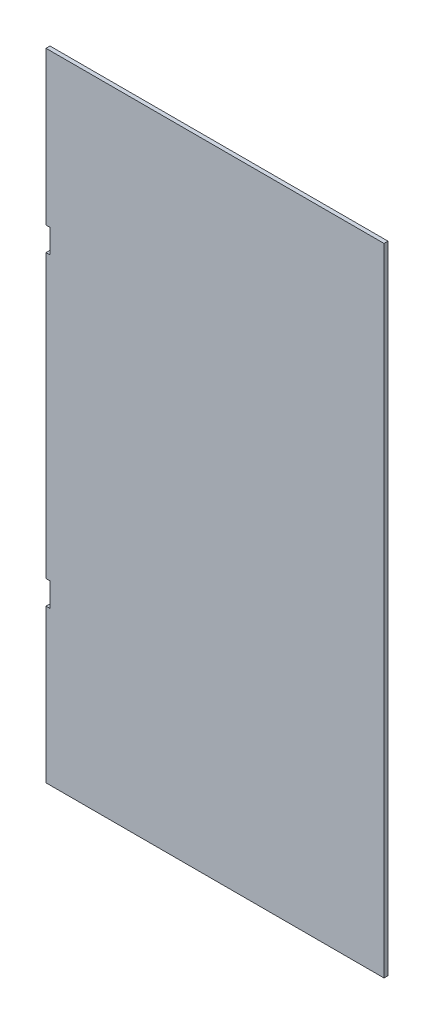
ISO-10303-21;
HEADER;
FILE_DESCRIPTION(('STEP AP214'),'2;1');
FILE_NAME('part.step','',(''),(''),'','','');
FILE_SCHEMA(('AUTOMOTIVE_DESIGN { 1 0 10303 214 1 1 1 1 }'));
ENDSEC;
DATA;
#1=APPLICATION_CONTEXT('core data for automotive mechanical design processes');
#2=APPLICATION_PROTOCOL_DEFINITION('international standard','automotive_design',2000,#1);
#3=PRODUCT_CONTEXT('',#1,'mechanical');
#4=PRODUCT('Part','Part','',(#3));
#5=PRODUCT_RELATED_PRODUCT_CATEGORY('part','',(#4));
#6=PRODUCT_DEFINITION_FORMATION('','',#4);
#7=PRODUCT_DEFINITION_CONTEXT('part definition',#1,'design');
#8=PRODUCT_DEFINITION('design','',#6,#7);
#9=PRODUCT_DEFINITION_SHAPE('','',#8);
#10=(LENGTH_UNIT() NAMED_UNIT(*) SI_UNIT(.MILLI.,.METRE.));
#11=(NAMED_UNIT(*) PLANE_ANGLE_UNIT() SI_UNIT($,.RADIAN.));
#12=(NAMED_UNIT(*) SI_UNIT($,.STERADIAN.) SOLID_ANGLE_UNIT());
#13=UNCERTAINTY_MEASURE_WITH_UNIT(LENGTH_MEASURE(1.E-05),#10,'distance_accuracy_value','');
#14=(GEOMETRIC_REPRESENTATION_CONTEXT(3) GLOBAL_UNCERTAINTY_ASSIGNED_CONTEXT((#13)) GLOBAL_UNIT_ASSIGNED_CONTEXT((#10,
#11,#12)) REPRESENTATION_CONTEXT('',''));
#15=CARTESIAN_POINT('',(0.,0.,0.));
#16=DIRECTION('',(0.,0.,1.));
#17=DIRECTION('',(1.,0.,0.));
#18=AXIS2_PLACEMENT_3D('',#15,#16,#17);
#19=CARTESIAN_POINT('',(-200.,400.,5.));
#20=DIRECTION('',(1.,0.,0.));
#21=DIRECTION('',(0.,1.,0.));
#22=AXIS2_PLACEMENT_3D('',#19,#20,#21);
#23=PLANE('',#22);
#24=DIRECTION('',(0.,0.,1.));
#25=VECTOR('',#24,1.);
#26=CARTESIAN_POINT('',(-200.,177.5,0.));
#27=LINE('',#26,#25);
#28=CARTESIAN_POINT('',(-200.,177.5,0.));
#29=VERTEX_POINT('',#28);
#30=CARTESIAN_POINT('',(-200.,177.5,5.));
#31=VERTEX_POINT('',#30);
#32=EDGE_CURVE('E172',#29,#31,#27,.T.);
#33=ORIENTED_EDGE('',*,*,#32,.F.);
#34=DIRECTION('',(0.,-1.,0.));
#35=VECTOR('',#34,1.);
#36=CARTESIAN_POINT('',(-200.,400.,0.));
#37=LINE('',#36,#35);
#38=CARTESIAN_POINT('',(-200.,-177.5,0.));
#39=VERTEX_POINT('',#38);
#40=EDGE_CURVE('E212',#29,#39,#37,.T.);
#41=ORIENTED_EDGE('',*,*,#40,.T.);
#42=DIRECTION('',(0.,0.,1.));
#43=VECTOR('',#42,1.);
#44=CARTESIAN_POINT('',(-200.,-177.5,0.));
#45=LINE('',#44,#43);
#46=CARTESIAN_POINT('',(-200.,-177.5,5.));
#47=VERTEX_POINT('',#46);
#48=EDGE_CURVE('E195',#39,#47,#45,.T.);
#49=ORIENTED_EDGE('',*,*,#48,.T.);
#50=DIRECTION('',(0.,-1.,0.));
#51=VECTOR('',#50,1.);
#52=CARTESIAN_POINT('',(-200.,400.,5.));
#53=LINE('',#52,#51);
#54=EDGE_CURVE('E207',#31,#47,#53,.T.);
#55=ORIENTED_EDGE('',*,*,#54,.F.);
#56=EDGE_LOOP('',(#33,#41,#49,#55));
#57=FACE_BOUND('',#56,.T.);
#58=ADVANCED_FACE('F35',(#57),#23,.F.);
#59=DIRECTION('',(0.,0.,1.));
#60=VECTOR('',#59,1.);
#61=CARTESIAN_POINT('',(-200.,-207.5,0.));
#62=LINE('',#61,#60);
#63=CARTESIAN_POINT('',(-200.,-207.5,0.));
#64=VERTEX_POINT('',#63);
#65=CARTESIAN_POINT('',(-200.,-207.5,5.));
#66=VERTEX_POINT('',#65);
#67=EDGE_CURVE('E168',#64,#66,#62,.T.);
#68=ORIENTED_EDGE('',*,*,#67,.F.);
#69=CARTESIAN_POINT('',(-200.,-400.,0.));
#70=VERTEX_POINT('',#69);
#71=EDGE_CURVE('E210',#64,#70,#37,.T.);
#72=ORIENTED_EDGE('',*,*,#71,.T.);
#73=DIRECTION('',(0.,0.,-1.));
#74=VECTOR('',#73,1.);
#75=CARTESIAN_POINT('',(-200.,-400.,5.));
#76=LINE('',#75,#74);
#77=CARTESIAN_POINT('',(-200.,-400.,5.));
#78=VERTEX_POINT('',#77);
#79=EDGE_CURVE('E43',#78,#70,#76,.T.);
#80=ORIENTED_EDGE('',*,*,#79,.F.);
#81=EDGE_CURVE('E202',#66,#78,#53,.T.);
#82=ORIENTED_EDGE('',*,*,#81,.F.);
#83=EDGE_LOOP('',(#68,#72,#80,#82));
#84=FACE_BOUND('',#83,.T.);
#85=ADVANCED_FACE('F217',(#84),#23,.F.);
#86=CARTESIAN_POINT('',(0.,0.,5.));
#87=DIRECTION('',(0.,0.,1.));
#88=DIRECTION('',(1.,0.,0.));
#89=AXIS2_PLACEMENT_3D('',#86,#87,#88);
#90=PLANE('',#89);
#91=DIRECTION('',(0.,-1.,0.));
#92=VECTOR('',#91,1.);
#93=CARTESIAN_POINT('',(-195.,0.,5.));
#94=LINE('',#93,#92);
#95=CARTESIAN_POINT('',(-195.,207.5,5.));
#96=VERTEX_POINT('',#95);
#97=CARTESIAN_POINT('',(-195.,177.5,5.));
#98=VERTEX_POINT('',#97);
#99=EDGE_CURVE('E167',#96,#98,#94,.T.);
#100=ORIENTED_EDGE('',*,*,#99,.T.);
#101=DIRECTION('',(-1.,0.,0.));
#102=VECTOR('',#101,1.);
#103=CARTESIAN_POINT('',(0.,177.5,5.));
#104=LINE('',#103,#102);
#105=EDGE_CURVE('E164',#98,#31,#104,.T.);
#106=ORIENTED_EDGE('',*,*,#105,.T.);
#107=ORIENTED_EDGE('',*,*,#54,.T.);
#108=DIRECTION('',(-1.,0.,0.));
#109=VECTOR('',#108,1.);
#110=CARTESIAN_POINT('',(0.,-177.5,5.));
#111=LINE('',#110,#109);
#112=CARTESIAN_POINT('',(-195.,-177.5,5.));
#113=VERTEX_POINT('',#112);
#114=EDGE_CURVE('E183',#113,#47,#111,.T.);
#115=ORIENTED_EDGE('',*,*,#114,.F.);
#116=DIRECTION('',(0.,1.,0.));
#117=VECTOR('',#116,1.);
#118=CARTESIAN_POINT('',(-195.,0.,5.));
#119=LINE('',#118,#117);
#120=CARTESIAN_POINT('',(-195.,-207.5,5.));
#121=VERTEX_POINT('',#120);
#122=EDGE_CURVE('E190',#121,#113,#119,.T.);
#123=ORIENTED_EDGE('',*,*,#122,.F.);
#124=DIRECTION('',(-1.,0.,0.));
#125=VECTOR('',#124,1.);
#126=CARTESIAN_POINT('',(-2.30371277609722E-12,-207.500000000002,5.));
#127=LINE('',#126,#125);
#128=EDGE_CURVE('E156',#121,#66,#127,.T.);
#129=ORIENTED_EDGE('',*,*,#128,.T.);
#130=ORIENTED_EDGE('',*,*,#81,.T.);
#131=DIRECTION('',(1.,0.,0.));
#132=VECTOR('',#131,1.);
#133=CARTESIAN_POINT('',(-200.,-400.,5.));
#134=LINE('',#133,#132);
#135=CARTESIAN_POINT('',(225.,-400.,5.));
#136=VERTEX_POINT('',#135);
#137=EDGE_CURVE('E206',#78,#136,#134,.T.);
#138=ORIENTED_EDGE('',*,*,#137,.T.);
#139=DIRECTION('',(0.,-1.,0.));
#140=VECTOR('',#139,1.);
#141=CARTESIAN_POINT('',(225.,400.,5.));
#142=LINE('',#141,#140);
#143=CARTESIAN_POINT('',(225.,400.,5.));
#144=VERTEX_POINT('',#143);
#145=EDGE_CURVE('E151',#144,#136,#142,.T.);
#146=ORIENTED_EDGE('',*,*,#145,.F.);
#147=DIRECTION('',(-1.,0.,0.));
#148=VECTOR('',#147,1.);
#149=CARTESIAN_POINT('',(-200.,400.,5.));
#150=LINE('',#149,#148);
#151=CARTESIAN_POINT('',(-200.,400.,5.));
#152=VERTEX_POINT('',#151);
#153=EDGE_CURVE('E134',#144,#152,#150,.T.);
#154=ORIENTED_EDGE('',*,*,#153,.T.);
#155=CARTESIAN_POINT('',(-200.,207.5,5.));
#156=VERTEX_POINT('',#155);
#157=EDGE_CURVE('E203',#152,#156,#53,.T.);
#158=ORIENTED_EDGE('',*,*,#157,.T.);
#159=DIRECTION('',(-1.,0.,0.));
#160=VECTOR('',#159,1.);
#161=CARTESIAN_POINT('',(-2.30371277609722E-12,207.500000000002,5.));
#162=LINE('',#161,#160);
#163=EDGE_CURVE('E160',#96,#156,#162,.T.);
#164=ORIENTED_EDGE('',*,*,#163,.F.);
#165=EDGE_LOOP('',(#100,#106,#107,#115,#123,#129,#130,#138,#146,#154,#158,#164));
#166=FACE_BOUND('',#165,.T.);
#167=ADVANCED_FACE('F235',(#166),#90,.T.);
#168=CARTESIAN_POINT('',(0.,0.,0.));
#169=DIRECTION('',(0.,0.,1.));
#170=DIRECTION('',(1.,0.,0.));
#171=AXIS2_PLACEMENT_3D('',#168,#169,#170);
#172=PLANE('',#171);
#173=DIRECTION('',(-1.,0.,0.));
#174=VECTOR('',#173,1.);
#175=CARTESIAN_POINT('',(0.,177.5,0.));
#176=LINE('',#175,#174);
#177=CARTESIAN_POINT('',(-195.,177.5,0.));
#178=VERTEX_POINT('',#177);
#179=EDGE_CURVE('E157',#178,#29,#176,.T.);
#180=ORIENTED_EDGE('',*,*,#179,.F.);
#181=DIRECTION('',(0.,-1.,0.));
#182=VECTOR('',#181,1.);
#183=CARTESIAN_POINT('',(-195.,0.,0.));
#184=LINE('',#183,#182);
#185=CARTESIAN_POINT('',(-195.,207.5,0.));
#186=VERTEX_POINT('',#185);
#187=EDGE_CURVE('E159',#186,#178,#184,.T.);
#188=ORIENTED_EDGE('',*,*,#187,.F.);
#189=DIRECTION('',(-1.,0.,0.));
#190=VECTOR('',#189,1.);
#191=CARTESIAN_POINT('',(-2.30371277609722E-12,207.500000000002,0.));
#192=LINE('',#191,#190);
#193=CARTESIAN_POINT('',(-200.,207.5,0.));
#194=VERTEX_POINT('',#193);
#195=EDGE_CURVE('E50',#186,#194,#192,.T.);
#196=ORIENTED_EDGE('',*,*,#195,.T.);
#197=CARTESIAN_POINT('',(-200.,400.,0.));
#198=VERTEX_POINT('',#197);
#199=EDGE_CURVE('E135',#198,#194,#37,.T.);
#200=ORIENTED_EDGE('',*,*,#199,.F.);
#201=DIRECTION('',(-1.,0.,0.));
#202=VECTOR('',#201,1.);
#203=CARTESIAN_POINT('',(-200.,400.,0.));
#204=LINE('',#203,#202);
#205=CARTESIAN_POINT('',(225.,400.,0.));
#206=VERTEX_POINT('',#205);
#207=EDGE_CURVE('E142',#206,#198,#204,.T.);
#208=ORIENTED_EDGE('',*,*,#207,.F.);
#209=DIRECTION('',(0.,1.,0.));
#210=VECTOR('',#209,1.);
#211=CARTESIAN_POINT('',(225.,-400.,0.));
#212=LINE('',#211,#210);
#213=CARTESIAN_POINT('',(225.,-400.,0.));
#214=VERTEX_POINT('',#213);
#215=EDGE_CURVE('E138',#214,#206,#212,.T.);
#216=ORIENTED_EDGE('',*,*,#215,.F.);
#217=DIRECTION('',(1.,0.,0.));
#218=VECTOR('',#217,1.);
#219=CARTESIAN_POINT('',(-200.,-400.,0.));
#220=LINE('',#219,#218);
#221=EDGE_CURVE('E125',#70,#214,#220,.T.);
#222=ORIENTED_EDGE('',*,*,#221,.F.);
#223=ORIENTED_EDGE('',*,*,#71,.F.);
#224=DIRECTION('',(-1.,0.,0.));
#225=VECTOR('',#224,1.);
#226=CARTESIAN_POINT('',(-2.30371277609722E-12,-207.500000000002,0.));
#227=LINE('',#226,#225);
#228=CARTESIAN_POINT('',(-195.,-207.5,0.));
#229=VERTEX_POINT('',#228);
#230=EDGE_CURVE('E180',#229,#64,#227,.T.);
#231=ORIENTED_EDGE('',*,*,#230,.F.);
#232=DIRECTION('',(0.,1.,0.));
#233=VECTOR('',#232,1.);
#234=CARTESIAN_POINT('',(-195.,0.,0.));
#235=LINE('',#234,#233);
#236=CARTESIAN_POINT('',(-195.,-177.5,0.));
#237=VERTEX_POINT('',#236);
#238=EDGE_CURVE('E182',#229,#237,#235,.T.);
#239=ORIENTED_EDGE('',*,*,#238,.T.);
#240=DIRECTION('',(-1.,0.,0.));
#241=VECTOR('',#240,1.);
#242=CARTESIAN_POINT('',(0.,-177.5,0.));
#243=LINE('',#242,#241);
#244=EDGE_CURVE('E58',#237,#39,#243,.T.);
#245=ORIENTED_EDGE('',*,*,#244,.T.);
#246=ORIENTED_EDGE('',*,*,#40,.F.);
#247=EDGE_LOOP('',(#180,#188,#196,#200,#208,#216,#222,#223,#231,#239,#245,#246));
#248=FACE_BOUND('',#247,.T.);
#249=ADVANCED_FACE('F140',(#248),#172,.F.);
#250=CARTESIAN_POINT('',(-200.,400.,5.));
#251=DIRECTION('',(0.,-1.,0.));
#252=DIRECTION('',(0.,0.,-1.));
#253=AXIS2_PLACEMENT_3D('',#250,#251,#252);
#254=PLANE('',#253);
#255=ORIENTED_EDGE('',*,*,#207,.T.);
#256=DIRECTION('',(0.,0.,-1.));
#257=VECTOR('',#256,1.);
#258=CARTESIAN_POINT('',(-200.,400.,5.));
#259=LINE('',#258,#257);
#260=EDGE_CURVE('E11',#152,#198,#259,.T.);
#261=ORIENTED_EDGE('',*,*,#260,.F.);
#262=ORIENTED_EDGE('',*,*,#153,.F.);
#263=DIRECTION('',(0.,0.,1.));
#264=VECTOR('',#263,1.);
#265=CARTESIAN_POINT('',(225.,400.,0.));
#266=LINE('',#265,#264);
#267=EDGE_CURVE('E146',#206,#144,#266,.T.);
#268=ORIENTED_EDGE('',*,*,#267,.F.);
#269=EDGE_LOOP('',(#255,#261,#262,#268));
#270=FACE_BOUND('',#269,.T.);
#271=ADVANCED_FACE('F37',(#270),#254,.F.);
#272=ORIENTED_EDGE('',*,*,#199,.T.);
#273=DIRECTION('',(0.,0.,1.));
#274=VECTOR('',#273,1.);
#275=CARTESIAN_POINT('',(-200.,207.5,0.));
#276=LINE('',#275,#274);
#277=EDGE_CURVE('E174',#194,#156,#276,.T.);
#278=ORIENTED_EDGE('',*,*,#277,.T.);
#279=ORIENTED_EDGE('',*,*,#157,.F.);
#280=ORIENTED_EDGE('',*,*,#260,.T.);
#281=EDGE_LOOP('',(#272,#278,#279,#280));
#282=FACE_BOUND('',#281,.T.);
#283=ADVANCED_FACE('F241',(#282),#23,.F.);
#284=CARTESIAN_POINT('',(-200.,-400.,5.));
#285=DIRECTION('',(0.,1.,0.));
#286=DIRECTION('',(0.,0.,1.));
#287=AXIS2_PLACEMENT_3D('',#284,#285,#286);
#288=PLANE('',#287);
#289=ORIENTED_EDGE('',*,*,#221,.T.);
#290=DIRECTION('',(0.,0.,-1.));
#291=VECTOR('',#290,1.);
#292=CARTESIAN_POINT('',(225.,-400.,5.));
#293=LINE('',#292,#291);
#294=EDGE_CURVE('E130',#136,#214,#293,.T.);
#295=ORIENTED_EDGE('',*,*,#294,.F.);
#296=ORIENTED_EDGE('',*,*,#137,.F.);
#297=ORIENTED_EDGE('',*,*,#79,.T.);
#298=EDGE_LOOP('',(#289,#295,#296,#297));
#299=FACE_BOUND('',#298,.T.);
#300=ADVANCED_FACE('F127',(#299),#288,.F.);
#301=CARTESIAN_POINT('',(-2.30371277609722E-12,-207.500000000002,0.));
#302=DIRECTION('',(0.,1.,0.));
#303=DIRECTION('',(-1.,0.,0.));
#304=AXIS2_PLACEMENT_3D('',#301,#302,#303);
#305=PLANE('',#304);
#306=ORIENTED_EDGE('',*,*,#128,.F.);
#307=DIRECTION('',(0.,0.,1.));
#308=VECTOR('',#307,1.);
#309=CARTESIAN_POINT('',(-195.,-207.5,0.));
#310=LINE('',#309,#308);
#311=EDGE_CURVE('E187',#229,#121,#310,.T.);
#312=ORIENTED_EDGE('',*,*,#311,.F.);
#313=ORIENTED_EDGE('',*,*,#230,.T.);
#314=ORIENTED_EDGE('',*,*,#67,.T.);
#315=EDGE_LOOP('',(#306,#312,#313,#314));
#316=FACE_BOUND('',#315,.T.);
#317=ADVANCED_FACE('F223',(#316),#305,.T.);
#318=CARTESIAN_POINT('',(0.,-177.5,0.));
#319=DIRECTION('',(0.,1.,0.));
#320=DIRECTION('',(0.,0.,1.));
#321=AXIS2_PLACEMENT_3D('',#318,#319,#320);
#322=PLANE('',#321);
#323=ORIENTED_EDGE('',*,*,#114,.T.);
#324=ORIENTED_EDGE('',*,*,#48,.F.);
#325=ORIENTED_EDGE('',*,*,#244,.F.);
#326=DIRECTION('',(0.,0.,1.));
#327=VECTOR('',#326,1.);
#328=CARTESIAN_POINT('',(-195.,-177.5,0.));
#329=LINE('',#328,#327);
#330=EDGE_CURVE('E198',#237,#113,#329,.T.);
#331=ORIENTED_EDGE('',*,*,#330,.T.);
#332=EDGE_LOOP('',(#323,#324,#325,#331));
#333=FACE_BOUND('',#332,.T.);
#334=ADVANCED_FACE('F228',(#333),#322,.F.);
#335=CARTESIAN_POINT('',(-195.,0.,0.));
#336=DIRECTION('',(1.,0.,0.));
#337=DIRECTION('',(0.,0.,-1.));
#338=AXIS2_PLACEMENT_3D('',#335,#336,#337);
#339=PLANE('',#338);
#340=ORIENTED_EDGE('',*,*,#122,.T.);
#341=ORIENTED_EDGE('',*,*,#330,.F.);
#342=ORIENTED_EDGE('',*,*,#238,.F.);
#343=ORIENTED_EDGE('',*,*,#311,.T.);
#344=EDGE_LOOP('',(#340,#341,#342,#343));
#345=FACE_BOUND('',#344,.T.);
#346=ADVANCED_FACE('F226',(#345),#339,.F.);
#347=CARTESIAN_POINT('',(0.,177.5,0.));
#348=DIRECTION('',(0.,1.,0.));
#349=DIRECTION('',(0.,0.,1.));
#350=AXIS2_PLACEMENT_3D('',#347,#348,#349);
#351=PLANE('',#350);
#352=ORIENTED_EDGE('',*,*,#105,.F.);
#353=DIRECTION('',(0.,0.,1.));
#354=VECTOR('',#353,1.);
#355=CARTESIAN_POINT('',(-195.,177.5,0.));
#356=LINE('',#355,#354);
#357=EDGE_CURVE('E163',#178,#98,#356,.T.);
#358=ORIENTED_EDGE('',*,*,#357,.F.);
#359=ORIENTED_EDGE('',*,*,#179,.T.);
#360=ORIENTED_EDGE('',*,*,#32,.T.);
#361=EDGE_LOOP('',(#352,#358,#359,#360));
#362=FACE_BOUND('',#361,.T.);
#363=ADVANCED_FACE('F249',(#362),#351,.T.);
#364=CARTESIAN_POINT('',(-2.30371277609722E-12,207.500000000002,0.));
#365=DIRECTION('',(0.,1.,0.));
#366=DIRECTION('',(-1.,0.,0.));
#367=AXIS2_PLACEMENT_3D('',#364,#365,#366);
#368=PLANE('',#367);
#369=ORIENTED_EDGE('',*,*,#163,.T.);
#370=ORIENTED_EDGE('',*,*,#277,.F.);
#371=ORIENTED_EDGE('',*,*,#195,.F.);
#372=DIRECTION('',(0.,0.,1.));
#373=VECTOR('',#372,1.);
#374=CARTESIAN_POINT('',(-195.,207.5,0.));
#375=LINE('',#374,#373);
#376=EDGE_CURVE('E177',#186,#96,#375,.T.);
#377=ORIENTED_EDGE('',*,*,#376,.T.);
#378=EDGE_LOOP('',(#369,#370,#371,#377));
#379=FACE_BOUND('',#378,.T.);
#380=ADVANCED_FACE('F242',(#379),#368,.F.);
#381=CARTESIAN_POINT('',(-195.,0.,0.));
#382=DIRECTION('',(-1.,0.,0.));
#383=DIRECTION('',(0.,0.,1.));
#384=AXIS2_PLACEMENT_3D('',#381,#382,#383);
#385=PLANE('',#384);
#386=ORIENTED_EDGE('',*,*,#99,.F.);
#387=ORIENTED_EDGE('',*,*,#376,.F.);
#388=ORIENTED_EDGE('',*,*,#187,.T.);
#389=ORIENTED_EDGE('',*,*,#357,.T.);
#390=EDGE_LOOP('',(#386,#387,#388,#389));
#391=FACE_BOUND('',#390,.T.);
#392=ADVANCED_FACE('F247',(#391),#385,.T.);
#393=CARTESIAN_POINT('',(225.,0.,0.));
#394=DIRECTION('',(1.,0.,0.));
#395=DIRECTION('',(0.,1.,0.));
#396=AXIS2_PLACEMENT_3D('',#393,#394,#395);
#397=PLANE('',#396);
#398=ORIENTED_EDGE('',*,*,#294,.T.);
#399=ORIENTED_EDGE('',*,*,#215,.T.);
#400=ORIENTED_EDGE('',*,*,#267,.T.);
#401=ORIENTED_EDGE('',*,*,#145,.T.);
#402=EDGE_LOOP('',(#398,#399,#400,#401));
#403=FACE_BOUND('',#402,.T.);
#404=ADVANCED_FACE('F149',(#403),#397,.T.);
#405=CLOSED_SHELL('',(#58,#85,#167,#249,#271,#283,#300,#317,#334,#346,#363,#380,#392,#404));
#406=MANIFOLD_SOLID_BREP('B2',#405);
#407=ADVANCED_BREP_SHAPE_REPRESENTATION('',(#18,#406),#14);
#408=SHAPE_DEFINITION_REPRESENTATION(#9,#407);
ENDSEC;
END-ISO-10303-21;
